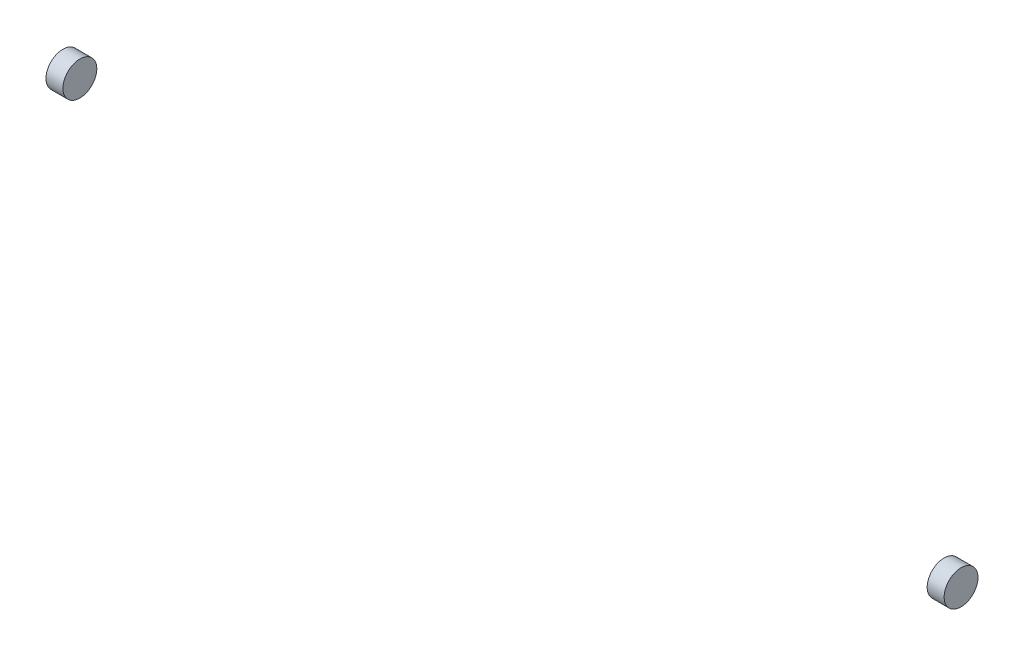
ISO-10303-21;
HEADER;
FILE_DESCRIPTION(('STEP AP214'),'2;1');
FILE_NAME('part.step','',(''),(''),'','','');
FILE_SCHEMA(('AUTOMOTIVE_DESIGN { 1 0 10303 214 1 1 1 1 }'));
ENDSEC;
DATA;
#1=APPLICATION_CONTEXT('core data for automotive mechanical design processes');
#2=APPLICATION_PROTOCOL_DEFINITION('international standard','automotive_design',2000,#1);
#3=PRODUCT_CONTEXT('',#1,'mechanical');
#4=PRODUCT('Part','Part','',(#3));
#5=PRODUCT_RELATED_PRODUCT_CATEGORY('part','',(#4));
#6=PRODUCT_DEFINITION_FORMATION('','',#4);
#7=PRODUCT_DEFINITION_CONTEXT('part definition',#1,'design');
#8=PRODUCT_DEFINITION('design','',#6,#7);
#9=PRODUCT_DEFINITION_SHAPE('','',#8);
#10=(LENGTH_UNIT() NAMED_UNIT(*) SI_UNIT(.MILLI.,.METRE.));
#11=(NAMED_UNIT(*) PLANE_ANGLE_UNIT() SI_UNIT($,.RADIAN.));
#12=(NAMED_UNIT(*) SI_UNIT($,.STERADIAN.) SOLID_ANGLE_UNIT());
#13=UNCERTAINTY_MEASURE_WITH_UNIT(LENGTH_MEASURE(1.E-05),#10,'distance_accuracy_value','');
#14=(GEOMETRIC_REPRESENTATION_CONTEXT(3) GLOBAL_UNCERTAINTY_ASSIGNED_CONTEXT((#13)) GLOBAL_UNIT_ASSIGNED_CONTEXT((#10,
#11,#12)) REPRESENTATION_CONTEXT('',''));
#15=CARTESIAN_POINT('',(0.,0.,0.));
#16=DIRECTION('',(0.,0.,1.));
#17=DIRECTION('',(1.,0.,0.));
#18=AXIS2_PLACEMENT_3D('',#15,#16,#17);
#19=CARTESIAN_POINT('',(3180.,-80.0000000000001,0.));
#20=DIRECTION('',(-1.,0.,0.));
#21=DIRECTION('',(0.,0.,1.));
#22=AXIS2_PLACEMENT_3D('',#19,#20,#21);
#23=CYLINDRICAL_SURFACE('',#22,120.);
#24=CARTESIAN_POINT('',(3180.,-80.0000000000001,0.));
#25=DIRECTION('',(1.,0.,0.));
#26=DIRECTION('',(0.,0.,-1.));
#27=AXIS2_PLACEMENT_3D('',#24,#25,#26);
#28=CIRCLE('',#27,120.);
#29=CARTESIAN_POINT('',(3180.,-80.0000000000001,-120.));
#30=VERTEX_POINT('',#29);
#31=EDGE_CURVE('E11',#30,#30,#28,.T.);
#32=ORIENTED_EDGE('',*,*,#31,.F.);
#33=EDGE_LOOP('',(#32));
#34=FACE_BOUND('',#33,.T.);
#35=CARTESIAN_POINT('',(3060.,-80.0000000000001,0.));
#36=DIRECTION('',(1.,0.,0.));
#37=DIRECTION('',(0.,0.,-1.));
#38=AXIS2_PLACEMENT_3D('',#35,#36,#37);
#39=CIRCLE('',#38,120.);
#40=CARTESIAN_POINT('',(3060.,-80.0000000000001,-120.));
#41=VERTEX_POINT('',#40);
#42=EDGE_CURVE('E48',#41,#41,#39,.T.);
#43=ORIENTED_EDGE('',*,*,#42,.T.);
#44=EDGE_LOOP('',(#43));
#45=FACE_BOUND('',#44,.T.);
#46=ADVANCED_FACE('F44',(#34,#45),#23,.T.);
#47=CARTESIAN_POINT('',(3180.,-80.0000000000001,0.));
#48=DIRECTION('',(1.,0.,0.));
#49=DIRECTION('',(0.,0.,-1.));
#50=AXIS2_PLACEMENT_3D('',#47,#48,#49);
#51=PLANE('',#50);
#52=ORIENTED_EDGE('',*,*,#31,.T.);
#53=EDGE_LOOP('',(#52));
#54=FACE_BOUND('',#53,.T.);
#55=ADVANCED_FACE('F58',(#54),#51,.T.);
#56=CARTESIAN_POINT('',(3060.,-80.0000000000001,0.));
#57=DIRECTION('',(1.,0.,0.));
#58=DIRECTION('',(0.,0.,-1.));
#59=AXIS2_PLACEMENT_3D('',#56,#57,#58);
#60=PLANE('',#59);
#61=ORIENTED_EDGE('',*,*,#42,.F.);
#62=EDGE_LOOP('',(#61));
#63=FACE_BOUND('',#62,.T.);
#64=ADVANCED_FACE('F59',(#63),#60,.F.);
#65=CLOSED_SHELL('',(#46,#55,#64));
#66=MANIFOLD_SOLID_BREP('B2',#65);
#67=CARTESIAN_POINT('',(-3060.,-80.0000000000001,0.));
#68=DIRECTION('',(-1.,0.,0.));
#69=DIRECTION('',(0.,0.,1.));
#70=AXIS2_PLACEMENT_3D('',#67,#68,#69);
#71=CYLINDRICAL_SURFACE('',#70,120.);
#72=CARTESIAN_POINT('',(-3060.,-80.0000000000001,0.));
#73=DIRECTION('',(1.,0.,0.));
#74=DIRECTION('',(0.,0.,-1.));
#75=AXIS2_PLACEMENT_3D('',#72,#73,#74);
#76=CIRCLE('',#75,120.);
#77=CARTESIAN_POINT('',(-3060.,-80.0000000000001,-120.));
#78=VERTEX_POINT('',#77);
#79=EDGE_CURVE('E42',#78,#78,#76,.T.);
#80=ORIENTED_EDGE('',*,*,#79,.F.);
#81=EDGE_LOOP('',(#80));
#82=FACE_BOUND('',#81,.T.);
#83=CARTESIAN_POINT('',(-3180.,-80.0000000000001,0.));
#84=DIRECTION('',(1.,0.,0.));
#85=DIRECTION('',(0.,0.,-1.));
#86=AXIS2_PLACEMENT_3D('',#83,#84,#85);
#87=CIRCLE('',#86,120.);
#88=CARTESIAN_POINT('',(-3180.,-80.0000000000001,-120.));
#89=VERTEX_POINT('',#88);
#90=EDGE_CURVE('E90',#89,#89,#87,.T.);
#91=ORIENTED_EDGE('',*,*,#90,.T.);
#92=EDGE_LOOP('',(#91));
#93=FACE_BOUND('',#92,.T.);
#94=ADVANCED_FACE('F88',(#82,#93),#71,.T.);
#95=CARTESIAN_POINT('',(-3060.,-80.0000000000001,0.));
#96=DIRECTION('',(1.,0.,0.));
#97=DIRECTION('',(0.,0.,-1.));
#98=AXIS2_PLACEMENT_3D('',#95,#96,#97);
#99=PLANE('',#98);
#100=ORIENTED_EDGE('',*,*,#79,.T.);
#101=EDGE_LOOP('',(#100));
#102=FACE_BOUND('',#101,.T.);
#103=ADVANCED_FACE('F101',(#102),#99,.T.);
#104=CARTESIAN_POINT('',(-3180.,-80.0000000000001,0.));
#105=DIRECTION('',(1.,0.,0.));
#106=DIRECTION('',(0.,0.,-1.));
#107=AXIS2_PLACEMENT_3D('',#104,#105,#106);
#108=PLANE('',#107);
#109=ORIENTED_EDGE('',*,*,#90,.F.);
#110=EDGE_LOOP('',(#109));
#111=FACE_BOUND('',#110,.T.);
#112=ADVANCED_FACE('F97',(#111),#108,.F.);
#113=CLOSED_SHELL('',(#94,#103,#112));
#114=MANIFOLD_SOLID_BREP('B6',#113);
#115=ADVANCED_BREP_SHAPE_REPRESENTATION('',(#18,#66,#114),#14);
#116=SHAPE_DEFINITION_REPRESENTATION(#9,#115);
ENDSEC;
END-ISO-10303-21;
